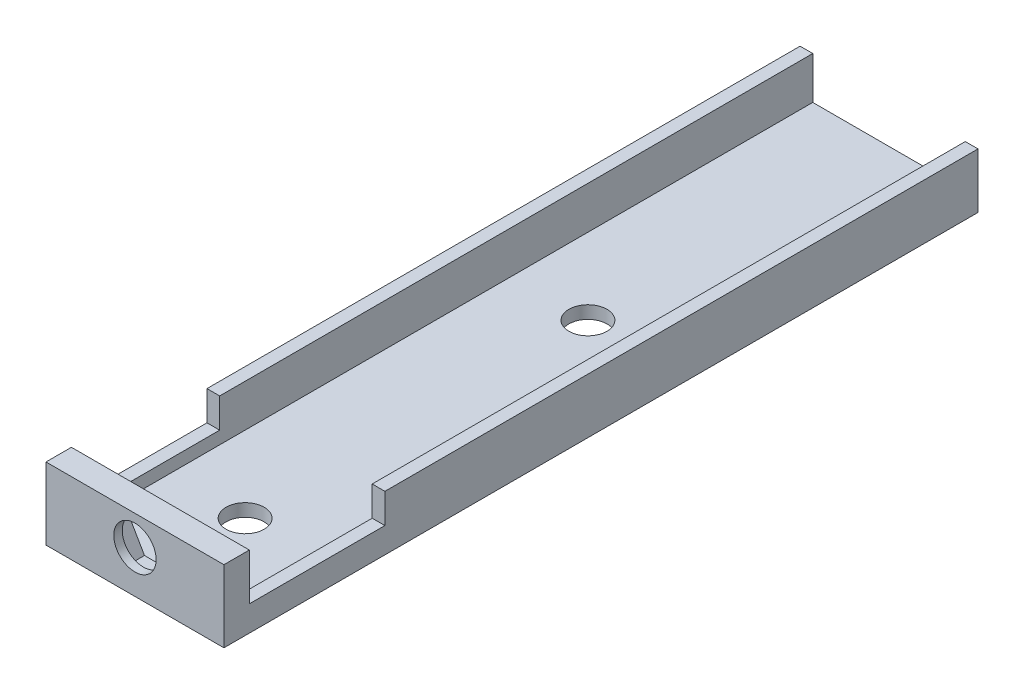
ISO-10303-21;
HEADER;
FILE_DESCRIPTION(('STEP AP214'),'2;1');
FILE_NAME('part.step','',(''),(''),'','','');
FILE_SCHEMA(('AUTOMOTIVE_DESIGN { 1 0 10303 214 1 1 1 1 }'));
ENDSEC;
DATA;
#1=APPLICATION_CONTEXT('core data for automotive mechanical design processes');
#2=APPLICATION_PROTOCOL_DEFINITION('international standard','automotive_design',2000,#1);
#3=PRODUCT_CONTEXT('',#1,'mechanical');
#4=PRODUCT('Part','Part','',(#3));
#5=PRODUCT_RELATED_PRODUCT_CATEGORY('part','',(#4));
#6=PRODUCT_DEFINITION_FORMATION('','',#4);
#7=PRODUCT_DEFINITION_CONTEXT('part definition',#1,'design');
#8=PRODUCT_DEFINITION('design','',#6,#7);
#9=PRODUCT_DEFINITION_SHAPE('','',#8);
#10=(LENGTH_UNIT() NAMED_UNIT(*) SI_UNIT(.MILLI.,.METRE.));
#11=(NAMED_UNIT(*) PLANE_ANGLE_UNIT() SI_UNIT($,.RADIAN.));
#12=(NAMED_UNIT(*) SI_UNIT($,.STERADIAN.) SOLID_ANGLE_UNIT());
#13=UNCERTAINTY_MEASURE_WITH_UNIT(LENGTH_MEASURE(1.E-05),#10,'distance_accuracy_value','');
#14=(GEOMETRIC_REPRESENTATION_CONTEXT(3) GLOBAL_UNCERTAINTY_ASSIGNED_CONTEXT((#13)) GLOBAL_UNIT_ASSIGNED_CONTEXT((#10,
#11,#12)) REPRESENTATION_CONTEXT('',''));
#15=CARTESIAN_POINT('',(0.,0.,0.));
#16=DIRECTION('',(0.,0.,1.));
#17=DIRECTION('',(1.,0.,0.));
#18=AXIS2_PLACEMENT_3D('',#15,#16,#17);
#19=CARTESIAN_POINT('',(39.,3.00000000000001,140.));
#20=DIRECTION('',(1.,0.,0.));
#21=DIRECTION('',(0.,0.,-1.));
#22=AXIS2_PLACEMENT_3D('',#19,#20,#21);
#23=PLANE('',#22);
#24=DIRECTION('',(0.,-1.,0.));
#25=VECTOR('',#24,1.);
#26=CARTESIAN_POINT('',(39.,0.,172.));
#27=LINE('',#26,#25);
#28=CARTESIAN_POINT('',(39.,6.00000000000001,172.));
#29=VERTEX_POINT('',#28);
#30=CARTESIAN_POINT('',(39.,3.00000000000001,172.));
#31=VERTEX_POINT('',#30);
#32=EDGE_CURVE('E274',#29,#31,#27,.T.);
#33=ORIENTED_EDGE('',*,*,#32,.F.);
#34=DIRECTION('',(0.,0.,-1.));
#35=VECTOR('',#34,1.);
#36=CARTESIAN_POINT('',(39.,6.00000000000001,176.));
#37=LINE('',#36,#35);
#38=CARTESIAN_POINT('',(39.,6.00000000000001,140.));
#39=VERTEX_POINT('',#38);
#40=EDGE_CURVE('E335',#29,#39,#37,.T.);
#41=ORIENTED_EDGE('',*,*,#40,.T.);
#42=DIRECTION('',(0.,-1.,0.));
#43=VECTOR('',#42,1.);
#44=CARTESIAN_POINT('',(39.,3.00000000000001,140.));
#45=LINE('',#44,#43);
#46=CARTESIAN_POINT('',(39.,13.,140.));
#47=VERTEX_POINT('',#46);
#48=EDGE_CURVE('E349',#47,#39,#45,.T.);
#49=ORIENTED_EDGE('',*,*,#48,.F.);
#50=DIRECTION('',(0.,0.,-1.));
#51=VECTOR('',#50,1.);
#52=CARTESIAN_POINT('',(39.,13.,140.));
#53=LINE('',#52,#51);
#54=CARTESIAN_POINT('',(39.,13.,0.));
#55=VERTEX_POINT('',#54);
#56=EDGE_CURVE('E403',#47,#55,#53,.T.);
#57=ORIENTED_EDGE('',*,*,#56,.T.);
#58=DIRECTION('',(0.,-1.,0.));
#59=VECTOR('',#58,1.);
#60=CARTESIAN_POINT('',(39.,3.00000000000001,0.));
#61=LINE('',#60,#59);
#62=CARTESIAN_POINT('',(39.,3.00000000000001,0.));
#63=VERTEX_POINT('',#62);
#64=EDGE_CURVE('E371',#55,#63,#61,.T.);
#65=ORIENTED_EDGE('',*,*,#64,.T.);
#66=DIRECTION('',(0.,0.,-1.));
#67=VECTOR('',#66,1.);
#68=CARTESIAN_POINT('',(39.,3.00000000000001,140.));
#69=LINE('',#68,#67);
#70=EDGE_CURVE('E400',#31,#63,#69,.T.);
#71=ORIENTED_EDGE('',*,*,#70,.F.);
#72=EDGE_LOOP('',(#33,#41,#49,#57,#65,#71));
#73=FACE_BOUND('',#72,.T.);
#74=ADVANCED_FACE('F43',(#73),#23,.F.);
#75=CARTESIAN_POINT('',(3.,3.00000000000001,140.));
#76=DIRECTION('',(0.,-1.,0.));
#77=DIRECTION('',(0.,0.,-1.));
#78=AXIS2_PLACEMENT_3D('',#75,#76,#77);
#79=PLANE('',#78);
#80=CARTESIAN_POINT('',(21.,3.00000000000001,152.));
#81=DIRECTION('',(0.,1.,0.));
#82=DIRECTION('',(0.,0.,1.));
#83=AXIS2_PLACEMENT_3D('',#80,#81,#82);
#84=CIRCLE('',#83,4.50000000000001);
#85=CARTESIAN_POINT('',(21.,3.00000000000001,156.5));
#86=VERTEX_POINT('',#85);
#87=EDGE_CURVE('E567',#86,#86,#84,.T.);
#88=ORIENTED_EDGE('',*,*,#87,.F.);
#89=EDGE_LOOP('',(#88));
#90=FACE_BOUND('',#89,.T.);
#91=CARTESIAN_POINT('',(21.,3.00000000000001,71.075));
#92=DIRECTION('',(0.,1.,0.));
#93=DIRECTION('',(0.,0.,1.));
#94=AXIS2_PLACEMENT_3D('',#91,#92,#93);
#95=CIRCLE('',#94,4.50000000000001);
#96=CARTESIAN_POINT('',(21.,3.00000000000001,75.575));
#97=VERTEX_POINT('',#96);
#98=EDGE_CURVE('E569',#97,#97,#95,.T.);
#99=ORIENTED_EDGE('',*,*,#98,.F.);
#100=EDGE_LOOP('',(#99));
#101=FACE_BOUND('',#100,.T.);
#102=DIRECTION('',(-1.,0.,0.));
#103=VECTOR('',#102,1.);
#104=CARTESIAN_POINT('',(0.,3.00000000000001,172.));
#105=LINE('',#104,#103);
#106=CARTESIAN_POINT('',(3.,3.00000000000001,172.));
#107=VERTEX_POINT('',#106);
#108=EDGE_CURVE('E271',#31,#107,#105,.T.);
#109=ORIENTED_EDGE('',*,*,#108,.F.);
#110=ORIENTED_EDGE('',*,*,#70,.T.);
#111=DIRECTION('',(-1.,0.,0.));
#112=VECTOR('',#111,1.);
#113=CARTESIAN_POINT('',(3.,3.00000000000001,0.));
#114=LINE('',#113,#112);
#115=CARTESIAN_POINT('',(3.,3.00000000000001,0.));
#116=VERTEX_POINT('',#115);
#117=EDGE_CURVE('E375',#63,#116,#114,.T.);
#118=ORIENTED_EDGE('',*,*,#117,.T.);
#119=DIRECTION('',(0.,0.,-1.));
#120=VECTOR('',#119,1.);
#121=CARTESIAN_POINT('',(3.,3.00000000000001,140.));
#122=LINE('',#121,#120);
#123=EDGE_CURVE('E397',#107,#116,#122,.T.);
#124=ORIENTED_EDGE('',*,*,#123,.F.);
#125=EDGE_LOOP('',(#109,#110,#118,#124));
#126=FACE_BOUND('',#125,.T.);
#127=ADVANCED_FACE('F462',(#90,#101,#126),#79,.F.);
#128=CARTESIAN_POINT('',(3.,13.,140.));
#129=DIRECTION('',(-1.,0.,0.));
#130=DIRECTION('',(0.,-1.,0.));
#131=AXIS2_PLACEMENT_3D('',#128,#129,#130);
#132=PLANE('',#131);
#133=DIRECTION('',(0.,1.,0.));
#134=VECTOR('',#133,1.);
#135=CARTESIAN_POINT('',(3.,0.,172.));
#136=LINE('',#135,#134);
#137=CARTESIAN_POINT('',(3.,6.,172.));
#138=VERTEX_POINT('',#137);
#139=EDGE_CURVE('E268',#107,#138,#136,.T.);
#140=ORIENTED_EDGE('',*,*,#139,.F.);
#141=ORIENTED_EDGE('',*,*,#123,.T.);
#142=DIRECTION('',(0.,1.,0.));
#143=VECTOR('',#142,1.);
#144=CARTESIAN_POINT('',(3.,13.,0.));
#145=LINE('',#144,#143);
#146=CARTESIAN_POINT('',(3.,13.,0.));
#147=VERTEX_POINT('',#146);
#148=EDGE_CURVE('E379',#116,#147,#145,.T.);
#149=ORIENTED_EDGE('',*,*,#148,.T.);
#150=DIRECTION('',(0.,0.,-1.));
#151=VECTOR('',#150,1.);
#152=CARTESIAN_POINT('',(3.,13.,140.));
#153=LINE('',#152,#151);
#154=CARTESIAN_POINT('',(3.,13.,140.));
#155=VERTEX_POINT('',#154);
#156=EDGE_CURVE('E393',#155,#147,#153,.T.);
#157=ORIENTED_EDGE('',*,*,#156,.F.);
#158=DIRECTION('',(0.,1.,0.));
#159=VECTOR('',#158,1.);
#160=CARTESIAN_POINT('',(3.,13.,140.));
#161=LINE('',#160,#159);
#162=CARTESIAN_POINT('',(3.,6.,140.));
#163=VERTEX_POINT('',#162);
#164=EDGE_CURVE('E353',#163,#155,#161,.T.);
#165=ORIENTED_EDGE('',*,*,#164,.F.);
#166=DIRECTION('',(0.,0.,-1.));
#167=VECTOR('',#166,1.);
#168=CARTESIAN_POINT('',(3.,6.,176.));
#169=LINE('',#168,#167);
#170=EDGE_CURVE('E67',#138,#163,#169,.T.);
#171=ORIENTED_EDGE('',*,*,#170,.F.);
#172=EDGE_LOOP('',(#140,#141,#149,#157,#165,#171));
#173=FACE_BOUND('',#172,.T.);
#174=ADVANCED_FACE('F444',(#173),#132,.F.);
#175=CARTESIAN_POINT('',(42.,6.00000000000001,176.));
#176=DIRECTION('',(0.,-1.,0.));
#177=DIRECTION('',(1.,0.,0.));
#178=AXIS2_PLACEMENT_3D('',#175,#176,#177);
#179=PLANE('',#178);
#180=DIRECTION('',(-1.,0.,0.));
#181=VECTOR('',#180,1.);
#182=CARTESIAN_POINT('',(0.,5.99999999999999,172.));
#183=LINE('',#182,#181);
#184=CARTESIAN_POINT('',(42.,6.00000000000001,172.));
#185=VERTEX_POINT('',#184);
#186=EDGE_CURVE('E253',#185,#29,#183,.T.);
#187=ORIENTED_EDGE('',*,*,#186,.F.);
#188=DIRECTION('',(0.,0.,-1.));
#189=VECTOR('',#188,1.);
#190=CARTESIAN_POINT('',(42.,6.00000000000001,176.));
#191=LINE('',#190,#189);
#192=CARTESIAN_POINT('',(42.,6.00000000000001,140.));
#193=VERTEX_POINT('',#192);
#194=EDGE_CURVE('E338',#185,#193,#191,.T.);
#195=ORIENTED_EDGE('',*,*,#194,.T.);
#196=DIRECTION('',(-1.,0.,0.));
#197=VECTOR('',#196,1.);
#198=CARTESIAN_POINT('',(42.,6.00000000000001,140.));
#199=LINE('',#198,#197);
#200=EDGE_CURVE('E194',#193,#39,#199,.T.);
#201=ORIENTED_EDGE('',*,*,#200,.T.);
#202=ORIENTED_EDGE('',*,*,#40,.F.);
#203=EDGE_LOOP('',(#187,#195,#201,#202));
#204=FACE_BOUND('',#203,.T.);
#205=ADVANCED_FACE('F432',(#204),#179,.F.);
#206=CARTESIAN_POINT('',(3.,6.,176.));
#207=DIRECTION('',(0.,-1.,0.));
#208=DIRECTION('',(0.,0.,-1.));
#209=AXIS2_PLACEMENT_3D('',#206,#207,#208);
#210=PLANE('',#209);
#211=DIRECTION('',(-1.,0.,0.));
#212=VECTOR('',#211,1.);
#213=CARTESIAN_POINT('',(0.,6.,172.));
#214=LINE('',#213,#212);
#215=CARTESIAN_POINT('',(0.,6.,172.));
#216=VERTEX_POINT('',#215);
#217=EDGE_CURVE('E265',#138,#216,#214,.T.);
#218=ORIENTED_EDGE('',*,*,#217,.F.);
#219=ORIENTED_EDGE('',*,*,#170,.T.);
#220=DIRECTION('',(-1.,0.,0.));
#221=VECTOR('',#220,1.);
#222=CARTESIAN_POINT('',(3.,6.,140.));
#223=LINE('',#222,#221);
#224=CARTESIAN_POINT('',(0.,6.,140.));
#225=VERTEX_POINT('',#224);
#226=EDGE_CURVE('E328',#163,#225,#223,.T.);
#227=ORIENTED_EDGE('',*,*,#226,.T.);
#228=DIRECTION('',(0.,0.,-1.));
#229=VECTOR('',#228,1.);
#230=CARTESIAN_POINT('',(0.,6.,176.));
#231=LINE('',#230,#229);
#232=EDGE_CURVE('E59',#216,#225,#231,.T.);
#233=ORIENTED_EDGE('',*,*,#232,.F.);
#234=EDGE_LOOP('',(#218,#219,#227,#233));
#235=FACE_BOUND('',#234,.T.);
#236=ADVANCED_FACE('F437',(#235),#210,.F.);
#237=CARTESIAN_POINT('',(0.,0.,140.));
#238=DIRECTION('',(0.,0.,-1.));
#239=DIRECTION('',(-1.,0.,0.));
#240=AXIS2_PLACEMENT_3D('',#237,#238,#239);
#241=PLANE('',#240);
#242=ORIENTED_EDGE('',*,*,#226,.F.);
#243=ORIENTED_EDGE('',*,*,#164,.T.);
#244=DIRECTION('',(-1.,0.,0.));
#245=VECTOR('',#244,1.);
#246=CARTESIAN_POINT('',(0.,13.,140.));
#247=LINE('',#246,#245);
#248=CARTESIAN_POINT('',(0.,13.,140.));
#249=VERTEX_POINT('',#248);
#250=EDGE_CURVE('E356',#155,#249,#247,.T.);
#251=ORIENTED_EDGE('',*,*,#250,.T.);
#252=DIRECTION('',(0.,-1.,0.));
#253=VECTOR('',#252,1.);
#254=CARTESIAN_POINT('',(0.,0.,140.));
#255=LINE('',#254,#253);
#256=EDGE_CURVE('E359',#249,#225,#255,.T.);
#257=ORIENTED_EDGE('',*,*,#256,.T.);
#258=EDGE_LOOP('',(#242,#243,#251,#257));
#259=FACE_BOUND('',#258,.T.);
#260=ADVANCED_FACE('F440',(#259),#241,.F.);
#261=ORIENTED_EDGE('',*,*,#200,.F.);
#262=DIRECTION('',(0.,1.,0.));
#263=VECTOR('',#262,1.);
#264=CARTESIAN_POINT('',(42.,13.,140.));
#265=LINE('',#264,#263);
#266=CARTESIAN_POINT('',(42.,13.,140.));
#267=VERTEX_POINT('',#266);
#268=EDGE_CURVE('E342',#193,#267,#265,.T.);
#269=ORIENTED_EDGE('',*,*,#268,.T.);
#270=DIRECTION('',(-1.,0.,0.));
#271=VECTOR('',#270,1.);
#272=CARTESIAN_POINT('',(39.,13.,140.));
#273=LINE('',#272,#271);
#274=EDGE_CURVE('E345',#267,#47,#273,.T.);
#275=ORIENTED_EDGE('',*,*,#274,.T.);
#276=ORIENTED_EDGE('',*,*,#48,.T.);
#277=EDGE_LOOP('',(#261,#269,#275,#276));
#278=FACE_BOUND('',#277,.T.);
#279=ADVANCED_FACE('F429',(#278),#241,.F.);
#280=CARTESIAN_POINT('',(42.,0.,140.));
#281=DIRECTION('',(0.,1.,0.));
#282=DIRECTION('',(-1.,0.,0.));
#283=AXIS2_PLACEMENT_3D('',#280,#281,#282);
#284=PLANE('',#283);
#285=CARTESIAN_POINT('',(21.,0.,152.));
#286=DIRECTION('',(0.,1.,0.));
#287=DIRECTION('',(0.,0.,1.));
#288=AXIS2_PLACEMENT_3D('',#285,#286,#287);
#289=CIRCLE('',#288,4.50000000000001);
#290=CARTESIAN_POINT('',(21.,0.,156.5));
#291=VERTEX_POINT('',#290);
#292=EDGE_CURVE('E218',#291,#291,#289,.T.);
#293=ORIENTED_EDGE('',*,*,#292,.T.);
#294=EDGE_LOOP('',(#293));
#295=FACE_BOUND('',#294,.T.);
#296=CARTESIAN_POINT('',(21.,0.,71.075));
#297=DIRECTION('',(0.,1.,0.));
#298=DIRECTION('',(0.,0.,1.));
#299=AXIS2_PLACEMENT_3D('',#296,#297,#298);
#300=CIRCLE('',#299,4.50000000000001);
#301=CARTESIAN_POINT('',(21.,0.,75.575));
#302=VERTEX_POINT('',#301);
#303=EDGE_CURVE('E221',#302,#302,#300,.T.);
#304=ORIENTED_EDGE('',*,*,#303,.T.);
#305=EDGE_LOOP('',(#304));
#306=FACE_BOUND('',#305,.T.);
#307=DIRECTION('',(1.,0.,0.));
#308=VECTOR('',#307,1.);
#309=CARTESIAN_POINT('',(42.,0.,0.));
#310=LINE('',#309,#308);
#311=CARTESIAN_POINT('',(0.,0.,0.));
#312=VERTEX_POINT('',#311);
#313=CARTESIAN_POINT('',(42.,0.,0.));
#314=VERTEX_POINT('',#313);
#315=EDGE_CURVE('E341',#312,#314,#310,.T.);
#316=ORIENTED_EDGE('',*,*,#315,.T.);
#317=DIRECTION('',(0.,0.,-1.));
#318=VECTOR('',#317,1.);
#319=CARTESIAN_POINT('',(42.,0.,140.));
#320=LINE('',#319,#318);
#321=CARTESIAN_POINT('',(42.,0.,178.));
#322=VERTEX_POINT('',#321);
#323=EDGE_CURVE('E11',#322,#314,#320,.T.);
#324=ORIENTED_EDGE('',*,*,#323,.F.);
#325=DIRECTION('',(1.,0.,0.));
#326=VECTOR('',#325,1.);
#327=CARTESIAN_POINT('',(0.,0.,178.));
#328=LINE('',#327,#326);
#329=CARTESIAN_POINT('',(0.,0.,178.));
#330=VERTEX_POINT('',#329);
#331=EDGE_CURVE('E206',#330,#322,#328,.T.);
#332=ORIENTED_EDGE('',*,*,#331,.F.);
#333=DIRECTION('',(0.,0.,-1.));
#334=VECTOR('',#333,1.);
#335=CARTESIAN_POINT('',(0.,0.,140.));
#336=LINE('',#335,#334);
#337=EDGE_CURVE('E201',#330,#312,#336,.T.);
#338=ORIENTED_EDGE('',*,*,#337,.T.);
#339=EDGE_LOOP('',(#316,#324,#332,#338));
#340=FACE_BOUND('',#339,.T.);
#341=ADVANCED_FACE('F45',(#295,#306,#340),#284,.F.);
#342=CARTESIAN_POINT('',(42.,13.,140.));
#343=DIRECTION('',(-1.,0.,0.));
#344=DIRECTION('',(0.,0.,1.));
#345=AXIS2_PLACEMENT_3D('',#342,#343,#344);
#346=PLANE('',#345);
#347=DIRECTION('',(0.,1.,0.));
#348=VECTOR('',#347,1.);
#349=CARTESIAN_POINT('',(42.,13.,0.));
#350=LINE('',#349,#348);
#351=CARTESIAN_POINT('',(42.,13.,0.));
#352=VERTEX_POINT('',#351);
#353=EDGE_CURVE('E365',#314,#352,#350,.T.);
#354=ORIENTED_EDGE('',*,*,#353,.T.);
#355=DIRECTION('',(0.,0.,-1.));
#356=VECTOR('',#355,1.);
#357=CARTESIAN_POINT('',(42.,13.,140.));
#358=LINE('',#357,#356);
#359=EDGE_CURVE('E52',#267,#352,#358,.T.);
#360=ORIENTED_EDGE('',*,*,#359,.F.);
#361=ORIENTED_EDGE('',*,*,#268,.F.);
#362=ORIENTED_EDGE('',*,*,#194,.F.);
#363=DIRECTION('',(0.,1.,0.));
#364=VECTOR('',#363,1.);
#365=CARTESIAN_POINT('',(42.,0.,172.));
#366=LINE('',#365,#364);
#367=CARTESIAN_POINT('',(42.,17.,172.));
#368=VERTEX_POINT('',#367);
#369=EDGE_CURVE('E256',#185,#368,#366,.T.);
#370=ORIENTED_EDGE('',*,*,#369,.T.);
#371=DIRECTION('',(0.,0.,1.));
#372=VECTOR('',#371,1.);
#373=CARTESIAN_POINT('',(42.,17.,172.));
#374=LINE('',#373,#372);
#375=CARTESIAN_POINT('',(42.,17.,178.));
#376=VERTEX_POINT('',#375);
#377=EDGE_CURVE('E195',#368,#376,#374,.T.);
#378=ORIENTED_EDGE('',*,*,#377,.T.);
#379=DIRECTION('',(0.,1.,0.));
#380=VECTOR('',#379,1.);
#381=CARTESIAN_POINT('',(42.,0.,178.));
#382=LINE('',#381,#380);
#383=EDGE_CURVE('E212',#322,#376,#382,.T.);
#384=ORIENTED_EDGE('',*,*,#383,.F.);
#385=ORIENTED_EDGE('',*,*,#323,.T.);
#386=EDGE_LOOP('',(#354,#360,#361,#362,#370,#378,#384,#385));
#387=FACE_BOUND('',#386,.T.);
#388=ADVANCED_FACE('F434',(#387),#346,.F.);
#389=CARTESIAN_POINT('',(39.,13.,140.));
#390=DIRECTION('',(0.,-1.,0.));
#391=DIRECTION('',(1.,0.,0.));
#392=AXIS2_PLACEMENT_3D('',#389,#390,#391);
#393=PLANE('',#392);
#394=DIRECTION('',(-1.,0.,0.));
#395=VECTOR('',#394,1.);
#396=CARTESIAN_POINT('',(39.,13.,0.));
#397=LINE('',#396,#395);
#398=EDGE_CURVE('E368',#352,#55,#397,.T.);
#399=ORIENTED_EDGE('',*,*,#398,.T.);
#400=ORIENTED_EDGE('',*,*,#56,.F.);
#401=ORIENTED_EDGE('',*,*,#274,.F.);
#402=ORIENTED_EDGE('',*,*,#359,.T.);
#403=EDGE_LOOP('',(#399,#400,#401,#402));
#404=FACE_BOUND('',#403,.T.);
#405=ADVANCED_FACE('F412',(#404),#393,.F.);
#406=CARTESIAN_POINT('',(0.,13.,140.));
#407=DIRECTION('',(0.,-1.,0.));
#408=DIRECTION('',(0.,0.,-1.));
#409=AXIS2_PLACEMENT_3D('',#406,#407,#408);
#410=PLANE('',#409);
#411=DIRECTION('',(-1.,0.,0.));
#412=VECTOR('',#411,1.);
#413=CARTESIAN_POINT('',(0.,13.,0.));
#414=LINE('',#413,#412);
#415=CARTESIAN_POINT('',(0.,13.,0.));
#416=VERTEX_POINT('',#415);
#417=EDGE_CURVE('E382',#147,#416,#414,.T.);
#418=ORIENTED_EDGE('',*,*,#417,.T.);
#419=DIRECTION('',(0.,0.,-1.));
#420=VECTOR('',#419,1.);
#421=CARTESIAN_POINT('',(0.,13.,140.));
#422=LINE('',#421,#420);
#423=EDGE_CURVE('E389',#249,#416,#422,.T.);
#424=ORIENTED_EDGE('',*,*,#423,.F.);
#425=ORIENTED_EDGE('',*,*,#250,.F.);
#426=ORIENTED_EDGE('',*,*,#156,.T.);
#427=EDGE_LOOP('',(#418,#424,#425,#426));
#428=FACE_BOUND('',#427,.T.);
#429=ADVANCED_FACE('F449',(#428),#410,.F.);
#430=CARTESIAN_POINT('',(0.,0.,140.));
#431=DIRECTION('',(1.,0.,0.));
#432=DIRECTION('',(0.,1.,0.));
#433=AXIS2_PLACEMENT_3D('',#430,#431,#432);
#434=PLANE('',#433);
#435=DIRECTION('',(0.,-1.,0.));
#436=VECTOR('',#435,1.);
#437=CARTESIAN_POINT('',(0.,0.,0.));
#438=LINE('',#437,#436);
#439=EDGE_CURVE('E346',#416,#312,#438,.T.);
#440=ORIENTED_EDGE('',*,*,#439,.T.);
#441=ORIENTED_EDGE('',*,*,#337,.F.);
#442=DIRECTION('',(0.,-1.,0.));
#443=VECTOR('',#442,1.);
#444=CARTESIAN_POINT('',(0.,0.,178.));
#445=LINE('',#444,#443);
#446=CARTESIAN_POINT('',(0.,17.,178.));
#447=VERTEX_POINT('',#446);
#448=EDGE_CURVE('E198',#447,#330,#445,.T.);
#449=ORIENTED_EDGE('',*,*,#448,.F.);
#450=DIRECTION('',(0.,0.,1.));
#451=VECTOR('',#450,1.);
#452=CARTESIAN_POINT('',(0.,17.,172.));
#453=LINE('',#452,#451);
#454=CARTESIAN_POINT('',(0.,17.,172.));
#455=VERTEX_POINT('',#454);
#456=EDGE_CURVE('E186',#455,#447,#453,.T.);
#457=ORIENTED_EDGE('',*,*,#456,.F.);
#458=DIRECTION('',(0.,1.,0.));
#459=VECTOR('',#458,1.);
#460=CARTESIAN_POINT('',(0.,0.,172.));
#461=LINE('',#460,#459);
#462=EDGE_CURVE('E262',#216,#455,#461,.T.);
#463=ORIENTED_EDGE('',*,*,#462,.F.);
#464=ORIENTED_EDGE('',*,*,#232,.T.);
#465=ORIENTED_EDGE('',*,*,#256,.F.);
#466=ORIENTED_EDGE('',*,*,#423,.T.);
#467=EDGE_LOOP('',(#440,#441,#449,#457,#463,#464,#465,#466));
#468=FACE_BOUND('',#467,.T.);
#469=ADVANCED_FACE('F199',(#468),#434,.F.);
#470=CARTESIAN_POINT('',(0.,0.,0.));
#471=DIRECTION('',(0.,0.,-1.));
#472=DIRECTION('',(-1.,0.,0.));
#473=AXIS2_PLACEMENT_3D('',#470,#471,#472);
#474=PLANE('',#473);
#475=ORIENTED_EDGE('',*,*,#315,.F.);
#476=ORIENTED_EDGE('',*,*,#439,.F.);
#477=ORIENTED_EDGE('',*,*,#417,.F.);
#478=ORIENTED_EDGE('',*,*,#148,.F.);
#479=ORIENTED_EDGE('',*,*,#117,.F.);
#480=ORIENTED_EDGE('',*,*,#64,.F.);
#481=ORIENTED_EDGE('',*,*,#398,.F.);
#482=ORIENTED_EDGE('',*,*,#353,.F.);
#483=EDGE_LOOP('',(#475,#476,#477,#478,#479,#480,#481,#482));
#484=FACE_BOUND('',#483,.T.);
#485=ADVANCED_FACE('F419',(#484),#474,.T.);
#486=CARTESIAN_POINT('',(0.,17.,172.));
#487=DIRECTION('',(0.,-1.,0.));
#488=DIRECTION('',(1.,0.,0.));
#489=AXIS2_PLACEMENT_3D('',#486,#487,#488);
#490=PLANE('',#489);
#491=ORIENTED_EDGE('',*,*,#456,.T.);
#492=DIRECTION('',(1.,0.,0.));
#493=VECTOR('',#492,1.);
#494=CARTESIAN_POINT('',(0.,17.,178.));
#495=LINE('',#494,#493);
#496=EDGE_CURVE('E191',#447,#376,#495,.T.);
#497=ORIENTED_EDGE('',*,*,#496,.T.);
#498=ORIENTED_EDGE('',*,*,#377,.F.);
#499=DIRECTION('',(1.,0.,0.));
#500=VECTOR('',#499,1.);
#501=CARTESIAN_POINT('',(0.,17.,172.));
#502=LINE('',#501,#500);
#503=EDGE_CURVE('E192',#455,#368,#502,.T.);
#504=ORIENTED_EDGE('',*,*,#503,.F.);
#505=EDGE_LOOP('',(#491,#497,#498,#504));
#506=FACE_BOUND('',#505,.T.);
#507=ADVANCED_FACE('F188',(#506),#490,.F.);
#508=CARTESIAN_POINT('',(17.0490381056767,-9.84326673973661,172.));
#509=DIRECTION('',(0.866025403784438,-0.5,0.));
#510=DIRECTION('',(0.5,0.866025403784439,0.));
#511=AXIS2_PLACEMENT_3D('',#508,#509,#510);
#512=PLANE('',#511);
#513=DIRECTION('',(0.5,0.866025403784439,0.));
#514=VECTOR('',#513,1.);
#515=CARTESIAN_POINT('',(17.0490381056767,-9.84326673973661,176.));
#516=LINE('',#515,#514);
#517=CARTESIAN_POINT('',(24.7527767497326,3.5,176.));
#518=VERTEX_POINT('',#517);
#519=CARTESIAN_POINT('',(28.5055534994651,10.,176.));
#520=VERTEX_POINT('',#519);
#521=EDGE_CURVE('E231',#518,#520,#516,.T.);
#522=ORIENTED_EDGE('',*,*,#521,.T.);
#523=DIRECTION('',(0.,0.,1.));
#524=VECTOR('',#523,1.);
#525=CARTESIAN_POINT('',(28.5055534994651,10.,172.));
#526=LINE('',#525,#524);
#527=CARTESIAN_POINT('',(28.5055534994651,10.,172.));
#528=VERTEX_POINT('',#527);
#529=EDGE_CURVE('E302',#528,#520,#526,.T.);
#530=ORIENTED_EDGE('',*,*,#529,.F.);
#531=DIRECTION('',(0.5,0.866025403784439,0.));
#532=VECTOR('',#531,1.);
#533=CARTESIAN_POINT('',(17.0490381056767,-9.84326673973661,172.));
#534=LINE('',#533,#532);
#535=CARTESIAN_POINT('',(24.7527767497326,3.5,172.));
#536=VERTEX_POINT('',#535);
#537=EDGE_CURVE('E233',#536,#528,#534,.T.);
#538=ORIENTED_EDGE('',*,*,#537,.F.);
#539=DIRECTION('',(0.,0.,1.));
#540=VECTOR('',#539,1.);
#541=CARTESIAN_POINT('',(24.7527767497326,3.5,172.));
#542=LINE('',#541,#540);
#543=EDGE_CURVE('E277',#536,#518,#542,.T.);
#544=ORIENTED_EDGE('',*,*,#543,.T.);
#545=EDGE_LOOP('',(#522,#530,#538,#544));
#546=FACE_BOUND('',#545,.T.);
#547=ADVANCED_FACE('F496',(#546),#512,.F.);
#548=CARTESIAN_POINT('',(25.709292143521,14.8432667397366,172.));
#549=DIRECTION('',(0.866025403784439,0.5,0.));
#550=DIRECTION('',(-0.5,0.866025403784439,0.));
#551=AXIS2_PLACEMENT_3D('',#548,#549,#550);
#552=PLANE('',#551);
#553=DIRECTION('',(-0.5,0.866025403784439,0.));
#554=VECTOR('',#553,1.);
#555=CARTESIAN_POINT('',(25.709292143521,14.8432667397366,176.));
#556=LINE('',#555,#554);
#557=CARTESIAN_POINT('',(24.7527767497326,16.5,176.));
#558=VERTEX_POINT('',#557);
#559=EDGE_CURVE('E238',#520,#558,#556,.T.);
#560=ORIENTED_EDGE('',*,*,#559,.T.);
#561=DIRECTION('',(0.,0.,1.));
#562=VECTOR('',#561,1.);
#563=CARTESIAN_POINT('',(24.7527767497326,16.5,172.));
#564=LINE('',#563,#562);
#565=CARTESIAN_POINT('',(24.7527767497326,16.5,172.));
#566=VERTEX_POINT('',#565);
#567=EDGE_CURVE('E306',#566,#558,#564,.T.);
#568=ORIENTED_EDGE('',*,*,#567,.F.);
#569=DIRECTION('',(-0.5,0.866025403784439,0.));
#570=VECTOR('',#569,1.);
#571=CARTESIAN_POINT('',(25.709292143521,14.8432667397366,172.));
#572=LINE('',#571,#570);
#573=EDGE_CURVE('E250',#528,#566,#572,.T.);
#574=ORIENTED_EDGE('',*,*,#573,.F.);
#575=ORIENTED_EDGE('',*,*,#529,.T.);
#576=EDGE_LOOP('',(#560,#568,#574,#575));
#577=FACE_BOUND('',#576,.T.);
#578=ADVANCED_FACE('F501',(#577),#552,.F.);
#579=CARTESIAN_POINT('',(0.,16.5,172.));
#580=DIRECTION('',(0.,1.,0.));
#581=DIRECTION('',(0.,0.,1.));
#582=AXIS2_PLACEMENT_3D('',#579,#580,#581);
#583=PLANE('',#582);
#584=DIRECTION('',(-1.,0.,0.));
#585=VECTOR('',#584,1.);
#586=CARTESIAN_POINT('',(0.,16.5,176.));
#587=LINE('',#586,#585);
#588=CARTESIAN_POINT('',(17.2472232502674,16.5,176.));
#589=VERTEX_POINT('',#588);
#590=EDGE_CURVE('E293',#558,#589,#587,.T.);
#591=ORIENTED_EDGE('',*,*,#590,.T.);
#592=DIRECTION('',(0.,0.,1.));
#593=VECTOR('',#592,1.);
#594=CARTESIAN_POINT('',(17.2472232502674,16.5,172.));
#595=LINE('',#594,#593);
#596=CARTESIAN_POINT('',(17.2472232502674,16.5,172.));
#597=VERTEX_POINT('',#596);
#598=EDGE_CURVE('E310',#597,#589,#595,.T.);
#599=ORIENTED_EDGE('',*,*,#598,.F.);
#600=DIRECTION('',(-1.,0.,0.));
#601=VECTOR('',#600,1.);
#602=CARTESIAN_POINT('',(0.,16.5,172.));
#603=LINE('',#602,#601);
#604=EDGE_CURVE('E247',#566,#597,#603,.T.);
#605=ORIENTED_EDGE('',*,*,#604,.F.);
#606=ORIENTED_EDGE('',*,*,#567,.T.);
#607=EDGE_LOOP('',(#591,#599,#605,#606));
#608=FACE_BOUND('',#607,.T.);
#609=ADVANCED_FACE('F508',(#608),#583,.F.);
#610=CARTESIAN_POINT('',(5.79070785647895,-3.3432667397366,172.));
#611=DIRECTION('',(-0.866025403784439,0.5,0.));
#612=DIRECTION('',(-0.5,-0.866025403784439,0.));
#613=AXIS2_PLACEMENT_3D('',#610,#611,#612);
#614=PLANE('',#613);
#615=DIRECTION('',(-0.5,-0.866025403784439,0.));
#616=VECTOR('',#615,1.);
#617=CARTESIAN_POINT('',(5.79070785647895,-3.3432667397366,176.));
#618=LINE('',#617,#616);
#619=CARTESIAN_POINT('',(13.4944465005349,10.,176.));
#620=VERTEX_POINT('',#619);
#621=EDGE_CURVE('E289',#589,#620,#618,.T.);
#622=ORIENTED_EDGE('',*,*,#621,.T.);
#623=DIRECTION('',(0.,0.,1.));
#624=VECTOR('',#623,1.);
#625=CARTESIAN_POINT('',(13.4944465005349,10.,172.));
#626=LINE('',#625,#624);
#627=CARTESIAN_POINT('',(13.4944465005349,10.,172.));
#628=VERTEX_POINT('',#627);
#629=EDGE_CURVE('E314',#628,#620,#626,.T.);
#630=ORIENTED_EDGE('',*,*,#629,.F.);
#631=DIRECTION('',(-0.5,-0.866025403784439,0.));
#632=VECTOR('',#631,1.);
#633=CARTESIAN_POINT('',(5.79070785647895,-3.3432667397366,172.));
#634=LINE('',#633,#632);
#635=EDGE_CURVE('E244',#597,#628,#634,.T.);
#636=ORIENTED_EDGE('',*,*,#635,.F.);
#637=ORIENTED_EDGE('',*,*,#598,.T.);
#638=EDGE_LOOP('',(#622,#630,#636,#637));
#639=FACE_BOUND('',#638,.T.);
#640=ADVANCED_FACE('F512',(#639),#614,.F.);
#641=CARTESIAN_POINT('',(14.4509618943233,8.34326673973661,172.));
#642=DIRECTION('',(-0.866025403784439,-0.5,0.));
#643=DIRECTION('',(0.5,-0.866025403784439,0.));
#644=AXIS2_PLACEMENT_3D('',#641,#642,#643);
#645=PLANE('',#644);
#646=DIRECTION('',(0.5,-0.866025403784439,0.));
#647=VECTOR('',#646,1.);
#648=CARTESIAN_POINT('',(14.4509618943233,8.34326673973661,176.));
#649=LINE('',#648,#647);
#650=CARTESIAN_POINT('',(17.2472232502674,3.5,176.));
#651=VERTEX_POINT('',#650);
#652=EDGE_CURVE('E285',#620,#651,#649,.T.);
#653=ORIENTED_EDGE('',*,*,#652,.T.);
#654=DIRECTION('',(0.,0.,1.));
#655=VECTOR('',#654,1.);
#656=CARTESIAN_POINT('',(17.2472232502674,3.5,172.));
#657=LINE('',#656,#655);
#658=CARTESIAN_POINT('',(17.2472232502674,3.5,172.));
#659=VERTEX_POINT('',#658);
#660=EDGE_CURVE('E318',#659,#651,#657,.T.);
#661=ORIENTED_EDGE('',*,*,#660,.F.);
#662=DIRECTION('',(0.5,-0.866025403784439,0.));
#663=VECTOR('',#662,1.);
#664=CARTESIAN_POINT('',(14.4509618943233,8.34326673973661,172.));
#665=LINE('',#664,#663);
#666=EDGE_CURVE('E241',#628,#659,#665,.T.);
#667=ORIENTED_EDGE('',*,*,#666,.F.);
#668=ORIENTED_EDGE('',*,*,#629,.T.);
#669=EDGE_LOOP('',(#653,#661,#667,#668));
#670=FACE_BOUND('',#669,.T.);
#671=ADVANCED_FACE('F516',(#670),#645,.F.);
#672=CARTESIAN_POINT('',(0.,3.5,172.));
#673=DIRECTION('',(0.,-1.,0.));
#674=DIRECTION('',(0.,0.,-1.));
#675=AXIS2_PLACEMENT_3D('',#672,#673,#674);
#676=PLANE('',#675);
#677=DIRECTION('',(1.,0.,0.));
#678=VECTOR('',#677,1.);
#679=CARTESIAN_POINT('',(0.,3.5,176.));
#680=LINE('',#679,#678);
#681=EDGE_CURVE('E281',#651,#518,#680,.T.);
#682=ORIENTED_EDGE('',*,*,#681,.T.);
#683=ORIENTED_EDGE('',*,*,#543,.F.);
#684=DIRECTION('',(1.,0.,0.));
#685=VECTOR('',#684,1.);
#686=CARTESIAN_POINT('',(0.,3.5,172.));
#687=LINE('',#686,#685);
#688=EDGE_CURVE('E237',#659,#536,#687,.T.);
#689=ORIENTED_EDGE('',*,*,#688,.F.);
#690=ORIENTED_EDGE('',*,*,#660,.T.);
#691=EDGE_LOOP('',(#682,#683,#689,#690));
#692=FACE_BOUND('',#691,.T.);
#693=ADVANCED_FACE('F520',(#692),#676,.F.);
#694=CARTESIAN_POINT('',(0.,0.,172.));
#695=DIRECTION('',(0.,0.,1.));
#696=DIRECTION('',(1.,0.,0.));
#697=AXIS2_PLACEMENT_3D('',#694,#695,#696);
#698=PLANE('',#697);
#699=ORIENTED_EDGE('',*,*,#537,.T.);
#700=ORIENTED_EDGE('',*,*,#573,.T.);
#701=ORIENTED_EDGE('',*,*,#604,.T.);
#702=ORIENTED_EDGE('',*,*,#635,.T.);
#703=ORIENTED_EDGE('',*,*,#666,.T.);
#704=ORIENTED_EDGE('',*,*,#688,.T.);
#705=EDGE_LOOP('',(#699,#700,#701,#702,#703,#704));
#706=FACE_BOUND('',#705,.T.);
#707=ORIENTED_EDGE('',*,*,#186,.T.);
#708=ORIENTED_EDGE('',*,*,#32,.T.);
#709=ORIENTED_EDGE('',*,*,#108,.T.);
#710=ORIENTED_EDGE('',*,*,#139,.T.);
#711=ORIENTED_EDGE('',*,*,#217,.T.);
#712=ORIENTED_EDGE('',*,*,#462,.T.);
#713=ORIENTED_EDGE('',*,*,#503,.T.);
#714=ORIENTED_EDGE('',*,*,#369,.F.);
#715=EDGE_LOOP('',(#707,#708,#709,#710,#711,#712,#713,#714));
#716=FACE_BOUND('',#715,.T.);
#717=ADVANCED_FACE('F436',(#706,#716),#698,.F.);
#718=CARTESIAN_POINT('',(21.,10.,178.));
#719=DIRECTION('',(0.,0.,-1.));
#720=DIRECTION('',(-1.,0.,0.));
#721=AXIS2_PLACEMENT_3D('',#718,#719,#720);
#722=CYLINDRICAL_SURFACE('',#721,5.);
#723=CARTESIAN_POINT('',(21.,10.,178.));
#724=DIRECTION('',(0.,0.,1.));
#725=DIRECTION('',(1.,0.,0.));
#726=AXIS2_PLACEMENT_3D('',#723,#724,#725);
#727=CIRCLE('',#726,5.);
#728=CARTESIAN_POINT('',(26.,10.,178.));
#729=VERTEX_POINT('',#728);
#730=EDGE_CURVE('E228',#729,#729,#727,.T.);
#731=ORIENTED_EDGE('',*,*,#730,.T.);
#732=EDGE_LOOP('',(#731));
#733=FACE_BOUND('',#732,.T.);
#734=CARTESIAN_POINT('',(21.,10.,176.));
#735=DIRECTION('',(0.,0.,1.));
#736=DIRECTION('',(1.,0.,0.));
#737=AXIS2_PLACEMENT_3D('',#734,#735,#736);
#738=CIRCLE('',#737,5.);
#739=CARTESIAN_POINT('',(26.,10.,176.));
#740=VERTEX_POINT('',#739);
#741=EDGE_CURVE('E214',#740,#740,#738,.T.);
#742=ORIENTED_EDGE('',*,*,#741,.F.);
#743=EDGE_LOOP('',(#742));
#744=FACE_BOUND('',#743,.T.);
#745=ADVANCED_FACE('F527',(#733,#744),#722,.F.);
#746=CARTESIAN_POINT('',(0.,0.,178.));
#747=DIRECTION('',(0.,0.,1.));
#748=DIRECTION('',(1.,0.,0.));
#749=AXIS2_PLACEMENT_3D('',#746,#747,#748);
#750=PLANE('',#749);
#751=ORIENTED_EDGE('',*,*,#496,.F.);
#752=ORIENTED_EDGE('',*,*,#448,.T.);
#753=ORIENTED_EDGE('',*,*,#331,.T.);
#754=ORIENTED_EDGE('',*,*,#383,.T.);
#755=EDGE_LOOP('',(#751,#752,#753,#754));
#756=FACE_BOUND('',#755,.T.);
#757=ORIENTED_EDGE('',*,*,#730,.F.);
#758=EDGE_LOOP('',(#757));
#759=FACE_BOUND('',#758,.T.);
#760=ADVANCED_FACE('F209',(#756,#759),#750,.T.);
#761=CARTESIAN_POINT('',(0.,0.,176.));
#762=DIRECTION('',(0.,0.,1.));
#763=DIRECTION('',(1.,0.,0.));
#764=AXIS2_PLACEMENT_3D('',#761,#762,#763);
#765=PLANE('',#764);
#766=ORIENTED_EDGE('',*,*,#521,.F.);
#767=ORIENTED_EDGE('',*,*,#681,.F.);
#768=ORIENTED_EDGE('',*,*,#652,.F.);
#769=ORIENTED_EDGE('',*,*,#621,.F.);
#770=ORIENTED_EDGE('',*,*,#590,.F.);
#771=ORIENTED_EDGE('',*,*,#559,.F.);
#772=EDGE_LOOP('',(#766,#767,#768,#769,#770,#771));
#773=FACE_BOUND('',#772,.T.);
#774=ORIENTED_EDGE('',*,*,#741,.T.);
#775=EDGE_LOOP('',(#774));
#776=FACE_BOUND('',#775,.T.);
#777=ADVANCED_FACE('F539',(#773,#776),#765,.F.);
#778=CARTESIAN_POINT('',(21.,0.,71.075));
#779=DIRECTION('',(0.,1.,0.));
#780=DIRECTION('',(0.,0.,1.));
#781=AXIS2_PLACEMENT_3D('',#778,#779,#780);
#782=CYLINDRICAL_SURFACE('',#781,4.50000000000001);
#783=ORIENTED_EDGE('',*,*,#303,.F.);
#784=EDGE_LOOP('',(#783));
#785=FACE_BOUND('',#784,.T.);
#786=ORIENTED_EDGE('',*,*,#98,.T.);
#787=EDGE_LOOP('',(#786));
#788=FACE_BOUND('',#787,.T.);
#789=ADVANCED_FACE('F544',(#785,#788),#782,.F.);
#790=CARTESIAN_POINT('',(21.,0.,152.));
#791=DIRECTION('',(0.,1.,0.));
#792=DIRECTION('',(0.,0.,1.));
#793=AXIS2_PLACEMENT_3D('',#790,#791,#792);
#794=CYLINDRICAL_SURFACE('',#793,4.50000000000001);
#795=ORIENTED_EDGE('',*,*,#292,.F.);
#796=EDGE_LOOP('',(#795));
#797=FACE_BOUND('',#796,.T.);
#798=ORIENTED_EDGE('',*,*,#87,.T.);
#799=EDGE_LOOP('',(#798));
#800=FACE_BOUND('',#799,.T.);
#801=ADVANCED_FACE('F557',(#797,#800),#794,.F.);
#802=CLOSED_SHELL('',(#74,#127,#174,#205,#236,#260,#279,#341,#388,#405,#429,#469,#485,#507,#547,
#578,#609,#640,#671,#693,#717,#745,#760,#777,#789,#801));
#803=MANIFOLD_SOLID_BREP('B2',#802);
#804=ADVANCED_BREP_SHAPE_REPRESENTATION('',(#18,#803),#14);
#805=SHAPE_DEFINITION_REPRESENTATION(#9,#804);
ENDSEC;
END-ISO-10303-21;
